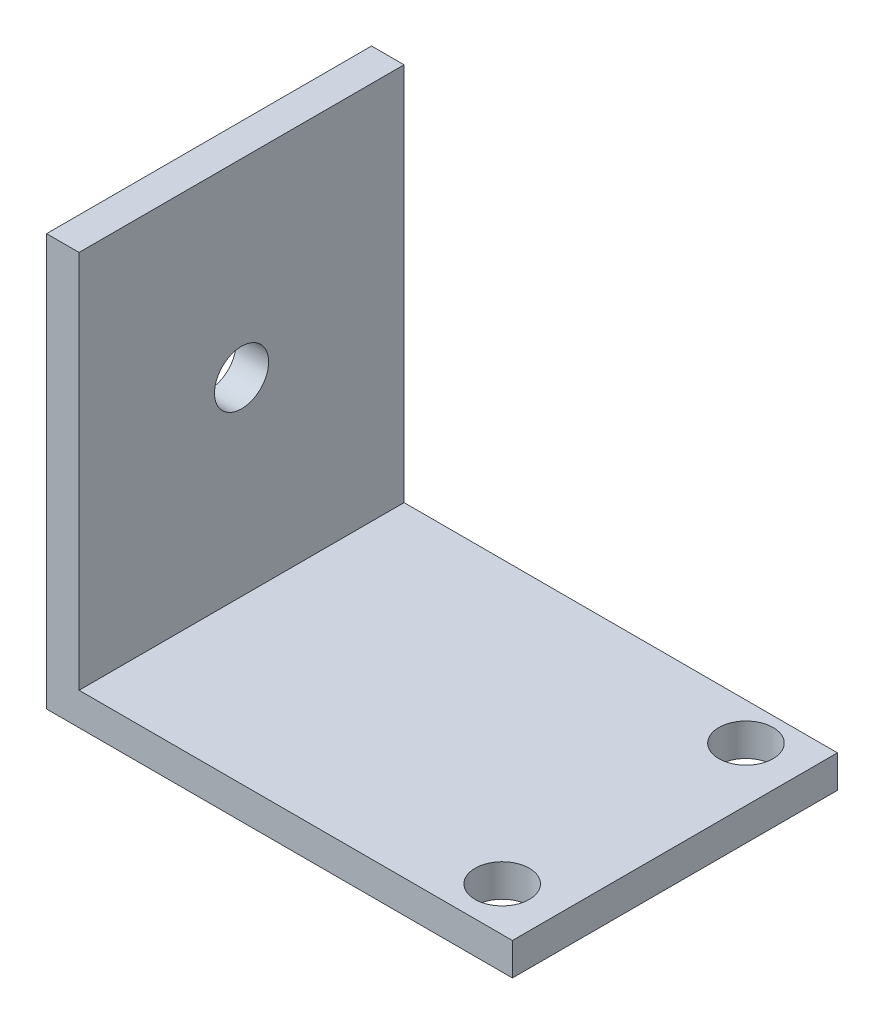
ISO-10303-21;
HEADER;
FILE_DESCRIPTION(('STEP AP214'),'2;1');
FILE_NAME('part.step','',(''),(''),'','','');
FILE_SCHEMA(('AUTOMOTIVE_DESIGN { 1 0 10303 214 1 1 1 1 }'));
ENDSEC;
DATA;
#1=APPLICATION_CONTEXT('core data for automotive mechanical design processes');
#2=APPLICATION_PROTOCOL_DEFINITION('international standard','automotive_design',2000,#1);
#3=PRODUCT_CONTEXT('',#1,'mechanical');
#4=PRODUCT('Part','Part','',(#3));
#5=PRODUCT_RELATED_PRODUCT_CATEGORY('part','',(#4));
#6=PRODUCT_DEFINITION_FORMATION('','',#4);
#7=PRODUCT_DEFINITION_CONTEXT('part definition',#1,'design');
#8=PRODUCT_DEFINITION('design','',#6,#7);
#9=PRODUCT_DEFINITION_SHAPE('','',#8);
#10=(LENGTH_UNIT() NAMED_UNIT(*) SI_UNIT(.MILLI.,.METRE.));
#11=(NAMED_UNIT(*) PLANE_ANGLE_UNIT() SI_UNIT($,.RADIAN.));
#12=(NAMED_UNIT(*) SI_UNIT($,.STERADIAN.) SOLID_ANGLE_UNIT());
#13=UNCERTAINTY_MEASURE_WITH_UNIT(LENGTH_MEASURE(1.E-05),#10,'distance_accuracy_value','');
#14=(GEOMETRIC_REPRESENTATION_CONTEXT(3) GLOBAL_UNCERTAINTY_ASSIGNED_CONTEXT((#13)) GLOBAL_UNIT_ASSIGNED_CONTEXT((#10,
#11,#12)) REPRESENTATION_CONTEXT('',''));
#15=CARTESIAN_POINT('',(0.,0.,0.));
#16=DIRECTION('',(0.,0.,1.));
#17=DIRECTION('',(1.,0.,0.));
#18=AXIS2_PLACEMENT_3D('',#15,#16,#17);
#19=CARTESIAN_POINT('',(0.,-6.,60.));
#20=DIRECTION('',(0.,1.,0.));
#21=DIRECTION('',(0.,0.,1.));
#22=AXIS2_PLACEMENT_3D('',#19,#20,#21);
#23=PLANE('',#22);
#24=CARTESIAN_POINT('',(70.,-6.,6.88767960496091));
#25=DIRECTION('',(0.,1.,0.));
#26=DIRECTION('',(0.,0.,1.));
#27=AXIS2_PLACEMENT_3D('',#24,#25,#26);
#28=CIRCLE('',#27,5.);
#29=CARTESIAN_POINT('',(70.,-6.,11.8876796049609));
#30=VERTEX_POINT('',#29);
#31=EDGE_CURVE('E124',#30,#30,#28,.T.);
#32=ORIENTED_EDGE('',*,*,#31,.T.);
#33=EDGE_LOOP('',(#32));
#34=FACE_BOUND('',#33,.T.);
#35=CARTESIAN_POINT('',(70.,-6.,51.8876796049609));
#36=DIRECTION('',(0.,1.,0.));
#37=DIRECTION('',(0.,0.,1.));
#38=AXIS2_PLACEMENT_3D('',#35,#36,#37);
#39=CIRCLE('',#38,5.00000000000001);
#40=CARTESIAN_POINT('',(70.,-6.,56.8876796049609));
#41=VERTEX_POINT('',#40);
#42=EDGE_CURVE('E173',#41,#41,#39,.T.);
#43=ORIENTED_EDGE('',*,*,#42,.T.);
#44=EDGE_LOOP('',(#43));
#45=FACE_BOUND('',#44,.T.);
#46=DIRECTION('',(1.,0.,0.));
#47=VECTOR('',#46,1.);
#48=CARTESIAN_POINT('',(0.,-6.,0.));
#49=LINE('',#48,#47);
#50=CARTESIAN_POINT('',(-6.,-6.,0.));
#51=VERTEX_POINT('',#50);
#52=CARTESIAN_POINT('',(80.,-6.,0.));
#53=VERTEX_POINT('',#52);
#54=EDGE_CURVE('E116',#51,#53,#49,.T.);
#55=ORIENTED_EDGE('',*,*,#54,.T.);
#56=DIRECTION('',(0.,0.,-1.));
#57=VECTOR('',#56,1.);
#58=CARTESIAN_POINT('',(80.,-6.,60.));
#59=LINE('',#58,#57);
#60=CARTESIAN_POINT('',(80.,-6.,60.));
#61=VERTEX_POINT('',#60);
#62=EDGE_CURVE('E11',#61,#53,#59,.T.);
#63=ORIENTED_EDGE('',*,*,#62,.F.);
#64=DIRECTION('',(1.,0.,0.));
#65=VECTOR('',#64,1.);
#66=CARTESIAN_POINT('',(0.,-6.,60.));
#67=LINE('',#66,#65);
#68=CARTESIAN_POINT('',(-6.,-6.,60.));
#69=VERTEX_POINT('',#68);
#70=EDGE_CURVE('E82',#69,#61,#67,.T.);
#71=ORIENTED_EDGE('',*,*,#70,.F.);
#72=DIRECTION('',(0.,0.,-1.));
#73=VECTOR('',#72,1.);
#74=CARTESIAN_POINT('',(-6.,-6.,60.));
#75=LINE('',#74,#73);
#76=EDGE_CURVE('E117',#69,#51,#75,.T.);
#77=ORIENTED_EDGE('',*,*,#76,.T.);
#78=EDGE_LOOP('',(#55,#63,#71,#77));
#79=FACE_BOUND('',#78,.T.);
#80=ADVANCED_FACE('F39',(#34,#45,#79),#23,.F.);
#81=CARTESIAN_POINT('',(80.,0.,60.));
#82=DIRECTION('',(1.,0.,0.));
#83=DIRECTION('',(0.,0.,-1.));
#84=AXIS2_PLACEMENT_3D('',#81,#82,#83);
#85=PLANE('',#84);
#86=DIRECTION('',(0.,-1.,0.));
#87=VECTOR('',#86,1.);
#88=CARTESIAN_POINT('',(80.,0.,0.));
#89=LINE('',#88,#87);
#90=CARTESIAN_POINT('',(80.,0.,0.));
#91=VERTEX_POINT('',#90);
#92=EDGE_CURVE('E121',#91,#53,#89,.T.);
#93=ORIENTED_EDGE('',*,*,#92,.F.);
#94=DIRECTION('',(0.,0.,-1.));
#95=VECTOR('',#94,1.);
#96=CARTESIAN_POINT('',(80.,0.,60.));
#97=LINE('',#96,#95);
#98=CARTESIAN_POINT('',(80.,0.,60.));
#99=VERTEX_POINT('',#98);
#100=EDGE_CURVE('E50',#99,#91,#97,.T.);
#101=ORIENTED_EDGE('',*,*,#100,.F.);
#102=DIRECTION('',(0.,-1.,0.));
#103=VECTOR('',#102,1.);
#104=CARTESIAN_POINT('',(80.,0.,60.));
#105=LINE('',#104,#103);
#106=EDGE_CURVE('E187',#99,#61,#105,.T.);
#107=ORIENTED_EDGE('',*,*,#106,.T.);
#108=ORIENTED_EDGE('',*,*,#62,.T.);
#109=EDGE_LOOP('',(#93,#101,#107,#108));
#110=FACE_BOUND('',#109,.T.);
#111=ADVANCED_FACE('F142',(#110),#85,.T.);
#112=CARTESIAN_POINT('',(0.,0.,60.));
#113=DIRECTION('',(0.,1.,0.));
#114=DIRECTION('',(0.,0.,1.));
#115=AXIS2_PLACEMENT_3D('',#112,#113,#114);
#116=PLANE('',#115);
#117=CARTESIAN_POINT('',(70.,0.,6.88767960496091));
#118=DIRECTION('',(0.,1.,0.));
#119=DIRECTION('',(0.,0.,1.));
#120=AXIS2_PLACEMENT_3D('',#117,#118,#119);
#121=CIRCLE('',#120,5.);
#122=CARTESIAN_POINT('',(70.,0.,11.8876796049609));
#123=VERTEX_POINT('',#122);
#124=EDGE_CURVE('E179',#123,#123,#121,.T.);
#125=ORIENTED_EDGE('',*,*,#124,.F.);
#126=EDGE_LOOP('',(#125));
#127=FACE_BOUND('',#126,.T.);
#128=CARTESIAN_POINT('',(70.,0.,51.8876796049609));
#129=DIRECTION('',(0.,1.,0.));
#130=DIRECTION('',(0.,0.,1.));
#131=AXIS2_PLACEMENT_3D('',#128,#129,#130);
#132=CIRCLE('',#131,5.00000000000001);
#133=CARTESIAN_POINT('',(70.,0.,56.8876796049609));
#134=VERTEX_POINT('',#133);
#135=EDGE_CURVE('E171',#134,#134,#132,.T.);
#136=ORIENTED_EDGE('',*,*,#135,.F.);
#137=EDGE_LOOP('',(#136));
#138=FACE_BOUND('',#137,.T.);
#139=DIRECTION('',(1.,0.,0.));
#140=VECTOR('',#139,1.);
#141=CARTESIAN_POINT('',(0.,0.,0.));
#142=LINE('',#141,#140);
#143=CARTESIAN_POINT('',(0.,0.,0.));
#144=VERTEX_POINT('',#143);
#145=EDGE_CURVE('E130',#144,#91,#142,.T.);
#146=ORIENTED_EDGE('',*,*,#145,.F.);
#147=DIRECTION('',(0.,0.,-1.));
#148=VECTOR('',#147,1.);
#149=CARTESIAN_POINT('',(0.,0.,60.));
#150=LINE('',#149,#148);
#151=CARTESIAN_POINT('',(0.,0.,60.));
#152=VERTEX_POINT('',#151);
#153=EDGE_CURVE('E106',#152,#144,#150,.T.);
#154=ORIENTED_EDGE('',*,*,#153,.F.);
#155=DIRECTION('',(1.,0.,0.));
#156=VECTOR('',#155,1.);
#157=CARTESIAN_POINT('',(0.,0.,60.));
#158=LINE('',#157,#156);
#159=EDGE_CURVE('E115',#152,#99,#158,.T.);
#160=ORIENTED_EDGE('',*,*,#159,.T.);
#161=ORIENTED_EDGE('',*,*,#100,.T.);
#162=EDGE_LOOP('',(#146,#154,#160,#161));
#163=FACE_BOUND('',#162,.T.);
#164=ADVANCED_FACE('F139',(#127,#138,#163),#116,.T.);
#165=CARTESIAN_POINT('',(0.,0.,60.));
#166=DIRECTION('',(1.,0.,0.));
#167=DIRECTION('',(0.,0.,-1.));
#168=AXIS2_PLACEMENT_3D('',#165,#166,#167);
#169=PLANE('',#168);
#170=CARTESIAN_POINT('',(0.,35.,30.));
#171=DIRECTION('',(1.,0.,0.));
#172=DIRECTION('',(0.,0.,-1.));
#173=AXIS2_PLACEMENT_3D('',#170,#171,#172);
#174=CIRCLE('',#173,5.);
#175=CARTESIAN_POINT('',(0.,35.,25.));
#176=VERTEX_POINT('',#175);
#177=EDGE_CURVE('E182',#176,#176,#174,.T.);
#178=ORIENTED_EDGE('',*,*,#177,.F.);
#179=EDGE_LOOP('',(#178));
#180=FACE_BOUND('',#179,.T.);
#181=DIRECTION('',(0.,-1.,0.));
#182=VECTOR('',#181,1.);
#183=CARTESIAN_POINT('',(0.,0.,0.));
#184=LINE('',#183,#182);
#185=CARTESIAN_POINT('',(0.,70.,0.));
#186=VERTEX_POINT('',#185);
#187=EDGE_CURVE('E101',#186,#144,#184,.T.);
#188=ORIENTED_EDGE('',*,*,#187,.F.);
#189=DIRECTION('',(0.,0.,-1.));
#190=VECTOR('',#189,1.);
#191=CARTESIAN_POINT('',(0.,70.,60.));
#192=LINE('',#191,#190);
#193=CARTESIAN_POINT('',(0.,70.,60.));
#194=VERTEX_POINT('',#193);
#195=EDGE_CURVE('E96',#194,#186,#192,.T.);
#196=ORIENTED_EDGE('',*,*,#195,.F.);
#197=DIRECTION('',(0.,-1.,0.));
#198=VECTOR('',#197,1.);
#199=CARTESIAN_POINT('',(0.,0.,60.));
#200=LINE('',#199,#198);
#201=EDGE_CURVE('E97',#194,#152,#200,.T.);
#202=ORIENTED_EDGE('',*,*,#201,.T.);
#203=ORIENTED_EDGE('',*,*,#153,.T.);
#204=EDGE_LOOP('',(#188,#196,#202,#203));
#205=FACE_BOUND('',#204,.T.);
#206=ADVANCED_FACE('F98',(#180,#205),#169,.T.);
#207=CARTESIAN_POINT('',(-6.,70.,60.));
#208=DIRECTION('',(0.,1.,0.));
#209=DIRECTION('',(0.,0.,1.));
#210=AXIS2_PLACEMENT_3D('',#207,#208,#209);
#211=PLANE('',#210);
#212=DIRECTION('',(1.,0.,0.));
#213=VECTOR('',#212,1.);
#214=CARTESIAN_POINT('',(-6.,70.,0.));
#215=LINE('',#214,#213);
#216=CARTESIAN_POINT('',(-6.,70.,0.));
#217=VERTEX_POINT('',#216);
#218=EDGE_CURVE('E132',#217,#186,#215,.T.);
#219=ORIENTED_EDGE('',*,*,#218,.F.);
#220=DIRECTION('',(0.,0.,-1.));
#221=VECTOR('',#220,1.);
#222=CARTESIAN_POINT('',(-6.,70.,60.));
#223=LINE('',#222,#221);
#224=CARTESIAN_POINT('',(-6.,70.,60.));
#225=VERTEX_POINT('',#224);
#226=EDGE_CURVE('E77',#225,#217,#223,.T.);
#227=ORIENTED_EDGE('',*,*,#226,.F.);
#228=DIRECTION('',(1.,0.,0.));
#229=VECTOR('',#228,1.);
#230=CARTESIAN_POINT('',(-6.,70.,60.));
#231=LINE('',#230,#229);
#232=EDGE_CURVE('E109',#225,#194,#231,.T.);
#233=ORIENTED_EDGE('',*,*,#232,.T.);
#234=ORIENTED_EDGE('',*,*,#195,.T.);
#235=EDGE_LOOP('',(#219,#227,#233,#234));
#236=FACE_BOUND('',#235,.T.);
#237=ADVANCED_FACE('F111',(#236),#211,.T.);
#238=CARTESIAN_POINT('',(-6.,0.,60.));
#239=DIRECTION('',(1.,0.,0.));
#240=DIRECTION('',(0.,0.,-1.));
#241=AXIS2_PLACEMENT_3D('',#238,#239,#240);
#242=PLANE('',#241);
#243=CARTESIAN_POINT('',(-6.,35.,30.));
#244=DIRECTION('',(1.,0.,0.));
#245=DIRECTION('',(0.,0.,-1.));
#246=AXIS2_PLACEMENT_3D('',#243,#244,#245);
#247=CIRCLE('',#246,5.);
#248=CARTESIAN_POINT('',(-6.,35.,25.));
#249=VERTEX_POINT('',#248);
#250=EDGE_CURVE('E178',#249,#249,#247,.T.);
#251=ORIENTED_EDGE('',*,*,#250,.T.);
#252=EDGE_LOOP('',(#251));
#253=FACE_BOUND('',#252,.T.);
#254=DIRECTION('',(0.,1.,0.));
#255=VECTOR('',#254,1.);
#256=CARTESIAN_POINT('',(-6.,0.,0.));
#257=LINE('',#256,#255);
#258=EDGE_CURVE('E79',#217,#51,#257,.F.);
#259=ORIENTED_EDGE('',*,*,#258,.T.);
#260=ORIENTED_EDGE('',*,*,#76,.F.);
#261=DIRECTION('',(0.,1.,0.));
#262=VECTOR('',#261,1.);
#263=CARTESIAN_POINT('',(-6.,0.,60.));
#264=LINE('',#263,#262);
#265=EDGE_CURVE('E54',#225,#69,#264,.F.);
#266=ORIENTED_EDGE('',*,*,#265,.F.);
#267=ORIENTED_EDGE('',*,*,#226,.T.);
#268=EDGE_LOOP('',(#259,#260,#266,#267));
#269=FACE_BOUND('',#268,.T.);
#270=ADVANCED_FACE('F150',(#253,#269),#242,.F.);
#271=CARTESIAN_POINT('',(0.,0.,60.));
#272=DIRECTION('',(0.,0.,-1.));
#273=DIRECTION('',(-1.,0.,0.));
#274=AXIS2_PLACEMENT_3D('',#271,#272,#273);
#275=PLANE('',#274);
#276=ORIENTED_EDGE('',*,*,#70,.T.);
#277=ORIENTED_EDGE('',*,*,#106,.F.);
#278=ORIENTED_EDGE('',*,*,#159,.F.);
#279=ORIENTED_EDGE('',*,*,#201,.F.);
#280=ORIENTED_EDGE('',*,*,#232,.F.);
#281=ORIENTED_EDGE('',*,*,#265,.T.);
#282=EDGE_LOOP('',(#276,#277,#278,#279,#280,#281));
#283=FACE_BOUND('',#282,.T.);
#284=ADVANCED_FACE('F108',(#283),#275,.F.);
#285=CARTESIAN_POINT('',(0.,0.,0.));
#286=DIRECTION('',(0.,0.,-1.));
#287=DIRECTION('',(-1.,0.,0.));
#288=AXIS2_PLACEMENT_3D('',#285,#286,#287);
#289=PLANE('',#288);
#290=ORIENTED_EDGE('',*,*,#54,.F.);
#291=ORIENTED_EDGE('',*,*,#258,.F.);
#292=ORIENTED_EDGE('',*,*,#218,.T.);
#293=ORIENTED_EDGE('',*,*,#187,.T.);
#294=ORIENTED_EDGE('',*,*,#145,.T.);
#295=ORIENTED_EDGE('',*,*,#92,.T.);
#296=EDGE_LOOP('',(#290,#291,#292,#293,#294,#295));
#297=FACE_BOUND('',#296,.T.);
#298=ADVANCED_FACE('F144',(#297),#289,.T.);
#299=CARTESIAN_POINT('',(70.,-6.,51.8876796049609));
#300=DIRECTION('',(0.,1.,0.));
#301=DIRECTION('',(0.,0.,1.));
#302=AXIS2_PLACEMENT_3D('',#299,#300,#301);
#303=CYLINDRICAL_SURFACE('',#302,5.00000000000001);
#304=ORIENTED_EDGE('',*,*,#42,.F.);
#305=EDGE_LOOP('',(#304));
#306=FACE_BOUND('',#305,.T.);
#307=ORIENTED_EDGE('',*,*,#135,.T.);
#308=EDGE_LOOP('',(#307));
#309=FACE_BOUND('',#308,.T.);
#310=ADVANCED_FACE('F208',(#306,#309),#303,.F.);
#311=CARTESIAN_POINT('',(70.,-6.,6.88767960496091));
#312=DIRECTION('',(0.,1.,0.));
#313=DIRECTION('',(0.,0.,1.));
#314=AXIS2_PLACEMENT_3D('',#311,#312,#313);
#315=CYLINDRICAL_SURFACE('',#314,5.);
#316=ORIENTED_EDGE('',*,*,#31,.F.);
#317=EDGE_LOOP('',(#316));
#318=FACE_BOUND('',#317,.T.);
#319=ORIENTED_EDGE('',*,*,#124,.T.);
#320=EDGE_LOOP('',(#319));
#321=FACE_BOUND('',#320,.T.);
#322=ADVANCED_FACE('F207',(#318,#321),#315,.F.);
#323=CARTESIAN_POINT('',(-6.,35.,30.));
#324=DIRECTION('',(1.,0.,0.));
#325=DIRECTION('',(0.,0.,-1.));
#326=AXIS2_PLACEMENT_3D('',#323,#324,#325);
#327=CYLINDRICAL_SURFACE('',#326,5.);
#328=ORIENTED_EDGE('',*,*,#250,.F.);
#329=EDGE_LOOP('',(#328));
#330=FACE_BOUND('',#329,.T.);
#331=ORIENTED_EDGE('',*,*,#177,.T.);
#332=EDGE_LOOP('',(#331));
#333=FACE_BOUND('',#332,.T.);
#334=ADVANCED_FACE('F191',(#330,#333),#327,.F.);
#335=CLOSED_SHELL('',(#80,#111,#164,#206,#237,#270,#284,#298,#310,#322,#334));
#336=MANIFOLD_SOLID_BREP('B2',#335);
#337=ADVANCED_BREP_SHAPE_REPRESENTATION('',(#18,#336),#14);
#338=SHAPE_DEFINITION_REPRESENTATION(#9,#337);
ENDSEC;
END-ISO-10303-21;
